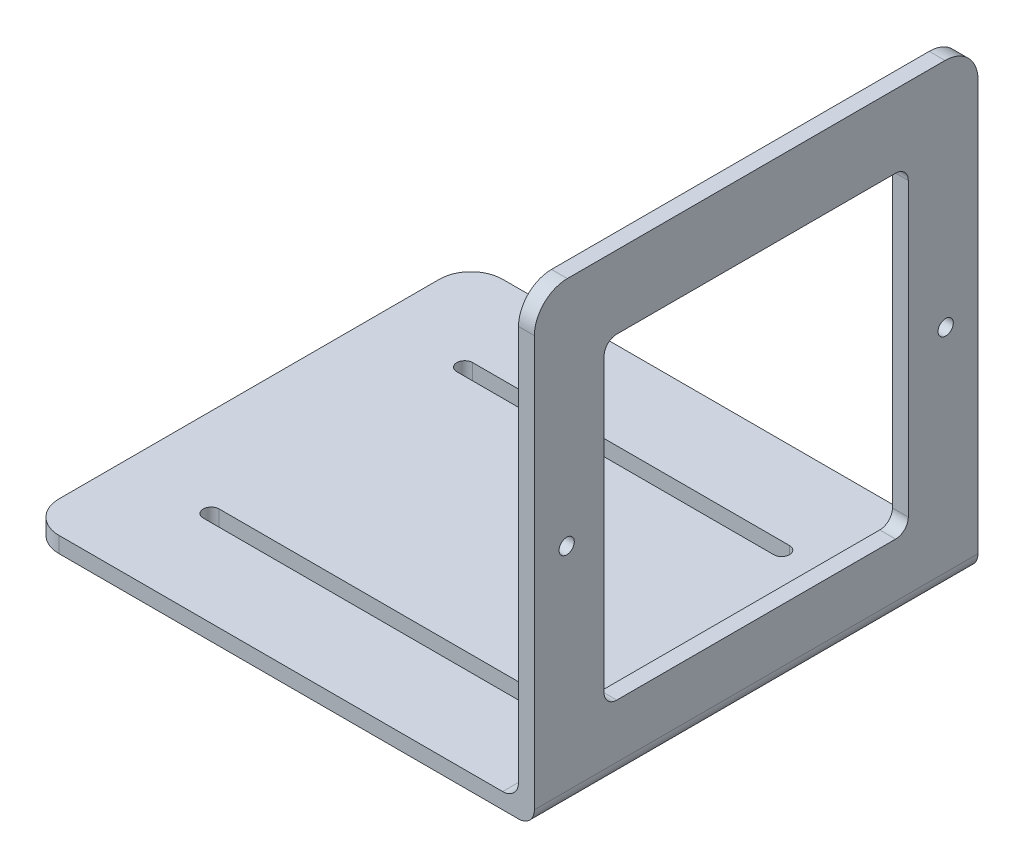
ISO-10303-21;
HEADER;
FILE_DESCRIPTION(('STEP AP214'),'2;1');
FILE_NAME('part.step','',(''),(''),'','','');
FILE_SCHEMA(('AUTOMOTIVE_DESIGN { 1 0 10303 214 1 1 1 1 }'));
ENDSEC;
DATA;
#1=APPLICATION_CONTEXT('core data for automotive mechanical design processes');
#2=APPLICATION_PROTOCOL_DEFINITION('international standard','automotive_design',2000,#1);
#3=PRODUCT_CONTEXT('',#1,'mechanical');
#4=PRODUCT('Part','Part','',(#3));
#5=PRODUCT_RELATED_PRODUCT_CATEGORY('part','',(#4));
#6=PRODUCT_DEFINITION_FORMATION('','',#4);
#7=PRODUCT_DEFINITION_CONTEXT('part definition',#1,'design');
#8=PRODUCT_DEFINITION('design','',#6,#7);
#9=PRODUCT_DEFINITION_SHAPE('','',#8);
#10=(LENGTH_UNIT() NAMED_UNIT(*) SI_UNIT(.MILLI.,.METRE.));
#11=(NAMED_UNIT(*) PLANE_ANGLE_UNIT() SI_UNIT($,.RADIAN.));
#12=(NAMED_UNIT(*) SI_UNIT($,.STERADIAN.) SOLID_ANGLE_UNIT());
#13=UNCERTAINTY_MEASURE_WITH_UNIT(LENGTH_MEASURE(1.E-05),#10,'distance_accuracy_value','');
#14=(GEOMETRIC_REPRESENTATION_CONTEXT(3) GLOBAL_UNCERTAINTY_ASSIGNED_CONTEXT((#13)) GLOBAL_UNIT_ASSIGNED_CONTEXT((#10,
#11,#12)) REPRESENTATION_CONTEXT('',''));
#15=CARTESIAN_POINT('',(0.,0.,0.));
#16=DIRECTION('',(0.,0.,1.));
#17=DIRECTION('',(1.,0.,0.));
#18=AXIS2_PLACEMENT_3D('',#15,#16,#17);
#19=CARTESIAN_POINT('',(0.,3.175,0.));
#20=DIRECTION('',(-1.,0.,0.));
#21=DIRECTION('',(0.,0.,1.));
#22=AXIS2_PLACEMENT_3D('',#19,#20,#21);
#23=PLANE('',#22);
#24=DIRECTION('',(0.,0.,-1.));
#25=VECTOR('',#24,1.);
#26=CARTESIAN_POINT('',(0.,3.175,0.));
#27=LINE('',#26,#25);
#28=CARTESIAN_POINT('',(0.,3.175,38.1));
#29=VERTEX_POINT('',#28);
#30=CARTESIAN_POINT('',(0.,3.175,-38.1));
#31=VERTEX_POINT('',#30);
#32=EDGE_CURVE('E323',#29,#31,#27,.T.);
#33=ORIENTED_EDGE('',*,*,#32,.T.);
#34=DIRECTION('',(0.,-1.,0.));
#35=VECTOR('',#34,1.);
#36=CARTESIAN_POINT('',(0.,3.175,-38.1));
#37=LINE('',#36,#35);
#38=CARTESIAN_POINT('',(0.,0.,-38.1));
#39=VERTEX_POINT('',#38);
#40=EDGE_CURVE('E436',#31,#39,#37,.T.);
#41=ORIENTED_EDGE('',*,*,#40,.T.);
#42=DIRECTION('',(0.,0.,-1.));
#43=VECTOR('',#42,1.);
#44=CARTESIAN_POINT('',(0.,0.,0.));
#45=LINE('',#44,#43);
#46=CARTESIAN_POINT('',(0.,0.,38.1));
#47=VERTEX_POINT('',#46);
#48=EDGE_CURVE('E322',#47,#39,#45,.T.);
#49=ORIENTED_EDGE('',*,*,#48,.F.);
#50=DIRECTION('',(0.,-1.,0.));
#51=VECTOR('',#50,1.);
#52=CARTESIAN_POINT('',(0.,3.175,38.1));
#53=LINE('',#52,#51);
#54=EDGE_CURVE('E434',#47,#29,#53,.F.);
#55=ORIENTED_EDGE('',*,*,#54,.T.);
#56=EDGE_LOOP('',(#33,#41,#49,#55));
#57=FACE_BOUND('',#56,.T.);
#58=ADVANCED_FACE('F36',(#57),#23,.T.);
#59=CARTESIAN_POINT('',(0.,3.175,44.45));
#60=DIRECTION('',(0.,0.,-1.));
#61=DIRECTION('',(-1.,0.,0.));
#62=AXIS2_PLACEMENT_3D('',#59,#60,#61);
#63=PLANE('',#62);
#64=DIRECTION('',(1.,0.,0.));
#65=VECTOR('',#64,1.);
#66=CARTESIAN_POINT('',(0.,3.175,44.45));
#67=LINE('',#66,#65);
#68=CARTESIAN_POINT('',(6.35,3.175,44.45));
#69=VERTEX_POINT('',#68);
#70=CARTESIAN_POINT('',(95.25,3.175,44.45));
#71=VERTEX_POINT('',#70);
#72=EDGE_CURVE('E326',#69,#71,#67,.T.);
#73=ORIENTED_EDGE('',*,*,#72,.F.);
#74=DIRECTION('',(0.,-1.,0.));
#75=VECTOR('',#74,1.);
#76=CARTESIAN_POINT('',(6.35,0.,44.45));
#77=LINE('',#76,#75);
#78=CARTESIAN_POINT('',(6.35,0.,44.45));
#79=VERTEX_POINT('',#78);
#80=EDGE_CURVE('E11',#69,#79,#77,.T.);
#81=ORIENTED_EDGE('',*,*,#80,.T.);
#82=DIRECTION('',(1.,0.,0.));
#83=VECTOR('',#82,1.);
#84=CARTESIAN_POINT('',(0.,0.,44.45));
#85=LINE('',#84,#83);
#86=CARTESIAN_POINT('',(98.425,0.,44.45));
#87=VERTEX_POINT('',#86);
#88=EDGE_CURVE('E334',#79,#87,#85,.T.);
#89=ORIENTED_EDGE('',*,*,#88,.T.);
#90=CARTESIAN_POINT('',(98.425,3.175,44.45));
#91=DIRECTION('',(0.,0.,-1.));
#92=DIRECTION('',(-1.,0.,0.));
#93=AXIS2_PLACEMENT_3D('',#90,#91,#92);
#94=CIRCLE('',#93,3.175);
#95=CARTESIAN_POINT('',(101.6,3.175,44.45));
#96=VERTEX_POINT('',#95);
#97=EDGE_CURVE('E427',#87,#96,#94,.F.);
#98=ORIENTED_EDGE('',*,*,#97,.T.);
#99=DIRECTION('',(0.,-1.,0.));
#100=VECTOR('',#99,1.);
#101=CARTESIAN_POINT('',(101.6,3.175,44.45));
#102=LINE('',#101,#100);
#103=CARTESIAN_POINT('',(101.6,85.471,44.45));
#104=VERTEX_POINT('',#103);
#105=EDGE_CURVE('E339',#104,#96,#102,.T.);
#106=ORIENTED_EDGE('',*,*,#105,.F.);
#107=DIRECTION('',(1.,0.,0.));
#108=VECTOR('',#107,1.);
#109=CARTESIAN_POINT('',(0.,85.471,44.45));
#110=LINE('',#109,#108);
#111=CARTESIAN_POINT('',(98.425,85.471,44.45));
#112=VERTEX_POINT('',#111);
#113=EDGE_CURVE('E404',#104,#112,#110,.F.);
#114=ORIENTED_EDGE('',*,*,#113,.T.);
#115=DIRECTION('',(0.,-1.,0.));
#116=VECTOR('',#115,1.);
#117=CARTESIAN_POINT('',(98.425,92.075,44.45));
#118=LINE('',#117,#116);
#119=CARTESIAN_POINT('',(98.425,6.34999999999999,44.45));
#120=VERTEX_POINT('',#119);
#121=EDGE_CURVE('E316',#112,#120,#118,.T.);
#122=ORIENTED_EDGE('',*,*,#121,.T.);
#123=CARTESIAN_POINT('',(95.25,6.34999999999999,44.45));
#124=DIRECTION('',(0.,0.,-1.));
#125=DIRECTION('',(-1.,0.,0.));
#126=AXIS2_PLACEMENT_3D('',#123,#124,#125);
#127=CIRCLE('',#126,3.175);
#128=EDGE_CURVE('E429',#120,#71,#127,.T.);
#129=ORIENTED_EDGE('',*,*,#128,.T.);
#130=EDGE_LOOP('',(#73,#81,#89,#98,#106,#114,#122,#129));
#131=FACE_BOUND('',#130,.T.);
#132=ADVANCED_FACE('F472',(#131),#63,.F.);
#133=CARTESIAN_POINT('',(101.6,3.175,0.));
#134=DIRECTION('',(-1.,0.,0.));
#135=DIRECTION('',(0.,0.,1.));
#136=AXIS2_PLACEMENT_3D('',#133,#134,#135);
#137=PLANE('',#136);
#138=CARTESIAN_POINT('',(101.6,45.72,37.973));
#139=DIRECTION('',(1.,0.,0.));
#140=DIRECTION('',(0.,0.,-1.));
#141=AXIS2_PLACEMENT_3D('',#138,#139,#140);
#142=CIRCLE('',#141,1.524);
#143=CARTESIAN_POINT('',(101.6,45.72,36.449));
#144=VERTEX_POINT('',#143);
#145=EDGE_CURVE('E291',#144,#144,#142,.T.);
#146=ORIENTED_EDGE('',*,*,#145,.F.);
#147=EDGE_LOOP('',(#146));
#148=FACE_BOUND('',#147,.T.);
#149=CARTESIAN_POINT('',(101.6,45.72,-37.973));
#150=DIRECTION('',(1.,0.,0.));
#151=DIRECTION('',(0.,0.,-1.));
#152=AXIS2_PLACEMENT_3D('',#149,#150,#151);
#153=CIRCLE('',#152,1.524);
#154=CARTESIAN_POINT('',(101.6,45.72,-39.497));
#155=VERTEX_POINT('',#154);
#156=EDGE_CURVE('E295',#155,#155,#153,.T.);
#157=ORIENTED_EDGE('',*,*,#156,.F.);
#158=EDGE_LOOP('',(#157));
#159=FACE_BOUND('',#158,.T.);
#160=DIRECTION('',(0.,0.,-1.));
#161=VECTOR('',#160,1.);
#162=CARTESIAN_POINT('',(101.6,13.97,-30.48));
#163=LINE('',#162,#161);
#164=CARTESIAN_POINT('',(101.6,13.97,27.94));
#165=VERTEX_POINT('',#164);
#166=CARTESIAN_POINT('',(101.6,13.97,-27.94));
#167=VERTEX_POINT('',#166);
#168=EDGE_CURVE('E301',#165,#167,#163,.T.);
#169=ORIENTED_EDGE('',*,*,#168,.F.);
#170=CARTESIAN_POINT('',(101.6,16.51,27.94));
#171=DIRECTION('',(-1.,0.,0.));
#172=DIRECTION('',(0.,0.,1.));
#173=AXIS2_PLACEMENT_3D('',#170,#171,#172);
#174=CIRCLE('',#173,2.54);
#175=CARTESIAN_POINT('',(101.6,16.51,30.48));
#176=VERTEX_POINT('',#175);
#177=EDGE_CURVE('E386',#165,#176,#174,.T.);
#178=ORIENTED_EDGE('',*,*,#177,.T.);
#179=DIRECTION('',(0.,-1.,0.));
#180=VECTOR('',#179,1.);
#181=CARTESIAN_POINT('',(101.6,13.97,30.48));
#182=LINE('',#181,#180);
#183=CARTESIAN_POINT('',(101.6,74.93,30.48));
#184=VERTEX_POINT('',#183);
#185=EDGE_CURVE('E258',#184,#176,#182,.T.);
#186=ORIENTED_EDGE('',*,*,#185,.F.);
#187=CARTESIAN_POINT('',(101.6,74.93,27.94));
#188=DIRECTION('',(-1.,0.,0.));
#189=DIRECTION('',(0.,0.,1.));
#190=AXIS2_PLACEMENT_3D('',#187,#188,#189);
#191=CIRCLE('',#190,2.54);
#192=CARTESIAN_POINT('',(101.6,77.47,27.94));
#193=VERTEX_POINT('',#192);
#194=EDGE_CURVE('E390',#184,#193,#191,.T.);
#195=ORIENTED_EDGE('',*,*,#194,.T.);
#196=DIRECTION('',(0.,0.,1.));
#197=VECTOR('',#196,1.);
#198=CARTESIAN_POINT('',(101.6,77.47,-30.48));
#199=LINE('',#198,#197);
#200=CARTESIAN_POINT('',(101.6,77.47,-27.94));
#201=VERTEX_POINT('',#200);
#202=EDGE_CURVE('E298',#201,#193,#199,.T.);
#203=ORIENTED_EDGE('',*,*,#202,.F.);
#204=CARTESIAN_POINT('',(101.6,74.93,-27.94));
#205=DIRECTION('',(-1.,0.,0.));
#206=DIRECTION('',(0.,0.,1.));
#207=AXIS2_PLACEMENT_3D('',#204,#205,#206);
#208=CIRCLE('',#207,2.54);
#209=CARTESIAN_POINT('',(101.6,74.93,-30.48));
#210=VERTEX_POINT('',#209);
#211=EDGE_CURVE('E382',#201,#210,#208,.T.);
#212=ORIENTED_EDGE('',*,*,#211,.T.);
#213=DIRECTION('',(0.,1.,0.));
#214=VECTOR('',#213,1.);
#215=CARTESIAN_POINT('',(101.6,13.97,-30.48));
#216=LINE('',#215,#214);
#217=CARTESIAN_POINT('',(101.6,16.51,-30.48));
#218=VERTEX_POINT('',#217);
#219=EDGE_CURVE('E304',#218,#210,#216,.T.);
#220=ORIENTED_EDGE('',*,*,#219,.F.);
#221=CARTESIAN_POINT('',(101.6,16.51,-27.94));
#222=DIRECTION('',(-1.,0.,0.));
#223=DIRECTION('',(0.,0.,1.));
#224=AXIS2_PLACEMENT_3D('',#221,#222,#223);
#225=CIRCLE('',#224,2.54);
#226=EDGE_CURVE('E378',#218,#167,#225,.T.);
#227=ORIENTED_EDGE('',*,*,#226,.T.);
#228=EDGE_LOOP('',(#169,#178,#186,#195,#203,#212,#220,#227));
#229=FACE_BOUND('',#228,.T.);
#230=ORIENTED_EDGE('',*,*,#105,.T.);
#231=DIRECTION('',(0.,0.,-1.));
#232=VECTOR('',#231,1.);
#233=CARTESIAN_POINT('',(101.6,3.175,0.));
#234=LINE('',#233,#232);
#235=CARTESIAN_POINT('',(101.6,3.175,-44.45));
#236=VERTEX_POINT('',#235);
#237=EDGE_CURVE('E418',#96,#236,#234,.T.);
#238=ORIENTED_EDGE('',*,*,#237,.T.);
#239=DIRECTION('',(0.,-1.,0.));
#240=VECTOR('',#239,1.);
#241=CARTESIAN_POINT('',(101.6,3.175,-44.45));
#242=LINE('',#241,#240);
#243=CARTESIAN_POINT('',(101.6,85.471,-44.45));
#244=VERTEX_POINT('',#243);
#245=EDGE_CURVE('E331',#244,#236,#242,.T.);
#246=ORIENTED_EDGE('',*,*,#245,.F.);
#247=CARTESIAN_POINT('',(101.6,85.471,-37.846));
#248=DIRECTION('',(-1.,0.,0.));
#249=DIRECTION('',(0.,0.,1.));
#250=AXIS2_PLACEMENT_3D('',#247,#248,#249);
#251=CIRCLE('',#250,6.604);
#252=CARTESIAN_POINT('',(101.6,92.075,-37.846));
#253=VERTEX_POINT('',#252);
#254=EDGE_CURVE('E400',#244,#253,#251,.F.);
#255=ORIENTED_EDGE('',*,*,#254,.T.);
#256=DIRECTION('',(0.,0.,-1.));
#257=VECTOR('',#256,1.);
#258=CARTESIAN_POINT('',(101.6,92.075,-44.45));
#259=LINE('',#258,#257);
#260=CARTESIAN_POINT('',(101.6,92.075,37.846));
#261=VERTEX_POINT('',#260);
#262=EDGE_CURVE('E309',#261,#253,#259,.T.);
#263=ORIENTED_EDGE('',*,*,#262,.F.);
#264=CARTESIAN_POINT('',(101.6,85.471,37.846));
#265=DIRECTION('',(-1.,0.,0.));
#266=DIRECTION('',(0.,0.,1.));
#267=AXIS2_PLACEMENT_3D('',#264,#265,#266);
#268=CIRCLE('',#267,6.604);
#269=EDGE_CURVE('E402',#261,#104,#268,.F.);
#270=ORIENTED_EDGE('',*,*,#269,.T.);
#271=EDGE_LOOP('',(#230,#238,#246,#255,#263,#270));
#272=FACE_BOUND('',#271,.T.);
#273=ADVANCED_FACE('F496',(#148,#159,#229,#272),#137,.F.);
#274=CARTESIAN_POINT('',(0.,3.175,-44.45));
#275=DIRECTION('',(0.,0.,-1.));
#276=DIRECTION('',(-1.,0.,0.));
#277=AXIS2_PLACEMENT_3D('',#274,#275,#276);
#278=PLANE('',#277);
#279=DIRECTION('',(1.,0.,0.));
#280=VECTOR('',#279,1.);
#281=CARTESIAN_POINT('',(0.,0.,-44.45));
#282=LINE('',#281,#280);
#283=CARTESIAN_POINT('',(6.35,0.,-44.45));
#284=VERTEX_POINT('',#283);
#285=CARTESIAN_POINT('',(98.425,0.,-44.45));
#286=VERTEX_POINT('',#285);
#287=EDGE_CURVE('E327',#284,#286,#282,.T.);
#288=ORIENTED_EDGE('',*,*,#287,.F.);
#289=DIRECTION('',(0.,-1.,0.));
#290=VECTOR('',#289,1.);
#291=CARTESIAN_POINT('',(6.35,3.175,-44.45));
#292=LINE('',#291,#290);
#293=CARTESIAN_POINT('',(6.35,3.175,-44.45));
#294=VERTEX_POINT('',#293);
#295=EDGE_CURVE('E443',#284,#294,#292,.F.);
#296=ORIENTED_EDGE('',*,*,#295,.T.);
#297=DIRECTION('',(1.,0.,0.));
#298=VECTOR('',#297,1.);
#299=CARTESIAN_POINT('',(0.,3.175,-44.45));
#300=LINE('',#299,#298);
#301=CARTESIAN_POINT('',(95.25,3.175,-44.45));
#302=VERTEX_POINT('',#301);
#303=EDGE_CURVE('E329',#294,#302,#300,.T.);
#304=ORIENTED_EDGE('',*,*,#303,.T.);
#305=CARTESIAN_POINT('',(95.25,6.34999999999999,-44.45));
#306=DIRECTION('',(0.,0.,-1.));
#307=DIRECTION('',(-1.,0.,0.));
#308=AXIS2_PLACEMENT_3D('',#305,#306,#307);
#309=CIRCLE('',#308,3.175);
#310=CARTESIAN_POINT('',(98.425,6.34999999999999,-44.45));
#311=VERTEX_POINT('',#310);
#312=EDGE_CURVE('E432',#302,#311,#309,.F.);
#313=ORIENTED_EDGE('',*,*,#312,.T.);
#314=DIRECTION('',(0.,-1.,0.));
#315=VECTOR('',#314,1.);
#316=CARTESIAN_POINT('',(98.425,92.075,-44.45));
#317=LINE('',#316,#315);
#318=CARTESIAN_POINT('',(98.425,85.471,-44.45));
#319=VERTEX_POINT('',#318);
#320=EDGE_CURVE('E319',#319,#311,#317,.T.);
#321=ORIENTED_EDGE('',*,*,#320,.F.);
#322=DIRECTION('',(-1.,0.,0.));
#323=VECTOR('',#322,1.);
#324=CARTESIAN_POINT('',(101.6,85.471,-44.45));
#325=LINE('',#324,#323);
#326=EDGE_CURVE('E410',#319,#244,#325,.F.);
#327=ORIENTED_EDGE('',*,*,#326,.T.);
#328=ORIENTED_EDGE('',*,*,#245,.T.);
#329=CARTESIAN_POINT('',(98.425,3.175,-44.45));
#330=DIRECTION('',(0.,0.,-1.));
#331=DIRECTION('',(-1.,0.,0.));
#332=AXIS2_PLACEMENT_3D('',#329,#330,#331);
#333=CIRCLE('',#332,3.175);
#334=EDGE_CURVE('E421',#236,#286,#333,.T.);
#335=ORIENTED_EDGE('',*,*,#334,.T.);
#336=EDGE_LOOP('',(#288,#296,#304,#313,#321,#327,#328,#335));
#337=FACE_BOUND('',#336,.T.);
#338=ADVANCED_FACE('F462',(#337),#278,.T.);
#339=CARTESIAN_POINT('',(0.,3.175,0.));
#340=DIRECTION('',(0.,1.,0.));
#341=DIRECTION('',(0.,0.,1.));
#342=AXIS2_PLACEMENT_3D('',#339,#340,#341);
#343=PLANE('',#342);
#344=CARTESIAN_POINT('',(17.7957258123316,3.175,-25.4));
#345=DIRECTION('',(0.,1.,0.));
#346=DIRECTION('',(0.,0.,1.));
#347=AXIS2_PLACEMENT_3D('',#344,#345,#346);
#348=CIRCLE('',#347,1.5875);
#349=CARTESIAN_POINT('',(17.7957258123316,3.175,-26.9875));
#350=VERTEX_POINT('',#349);
#351=CARTESIAN_POINT('',(17.7957258123316,3.175,-23.8125));
#352=VERTEX_POINT('',#351);
#353=EDGE_CURVE('E51',#350,#352,#348,.T.);
#354=ORIENTED_EDGE('',*,*,#353,.F.);
#355=DIRECTION('',(-1.,0.,0.));
#356=VECTOR('',#355,1.);
#357=CARTESIAN_POINT('',(17.7957258123316,3.175,-26.9875));
#358=LINE('',#357,#356);
#359=CARTESIAN_POINT('',(81.2957258123316,3.175,-26.9875));
#360=VERTEX_POINT('',#359);
#361=EDGE_CURVE('E242',#360,#350,#358,.T.);
#362=ORIENTED_EDGE('',*,*,#361,.F.);
#363=CARTESIAN_POINT('',(81.2957258123316,3.175,-25.4));
#364=DIRECTION('',(0.,1.,0.));
#365=DIRECTION('',(0.,0.,1.));
#366=AXIS2_PLACEMENT_3D('',#363,#364,#365);
#367=CIRCLE('',#366,1.5875);
#368=CARTESIAN_POINT('',(81.2957258123316,3.175,-23.8125));
#369=VERTEX_POINT('',#368);
#370=EDGE_CURVE('E245',#369,#360,#367,.T.);
#371=ORIENTED_EDGE('',*,*,#370,.F.);
#372=DIRECTION('',(1.,0.,0.));
#373=VECTOR('',#372,1.);
#374=CARTESIAN_POINT('',(17.7957258123316,3.175,-23.8125));
#375=LINE('',#374,#373);
#376=EDGE_CURVE('E251',#352,#369,#375,.T.);
#377=ORIENTED_EDGE('',*,*,#376,.F.);
#378=EDGE_LOOP('',(#354,#362,#371,#377));
#379=FACE_BOUND('',#378,.T.);
#380=CARTESIAN_POINT('',(17.7957258123316,3.175,25.4));
#381=DIRECTION('',(0.,1.,0.));
#382=DIRECTION('',(0.,0.,-1.));
#383=AXIS2_PLACEMENT_3D('',#380,#381,#382);
#384=CIRCLE('',#383,1.5875);
#385=CARTESIAN_POINT('',(17.7957258123316,3.175,23.8125));
#386=VERTEX_POINT('',#385);
#387=CARTESIAN_POINT('',(17.7957258123316,3.175,26.9875));
#388=VERTEX_POINT('',#387);
#389=EDGE_CURVE('E59',#386,#388,#384,.T.);
#390=ORIENTED_EDGE('',*,*,#389,.F.);
#391=DIRECTION('',(-1.,0.,0.));
#392=VECTOR('',#391,1.);
#393=CARTESIAN_POINT('',(17.7957258123316,3.175,23.8125));
#394=LINE('',#393,#392);
#395=CARTESIAN_POINT('',(81.2957258123316,3.175,23.8125));
#396=VERTEX_POINT('',#395);
#397=EDGE_CURVE('E266',#396,#386,#394,.T.);
#398=ORIENTED_EDGE('',*,*,#397,.F.);
#399=CARTESIAN_POINT('',(81.2957258123316,3.175,25.4));
#400=DIRECTION('',(0.,1.,0.));
#401=DIRECTION('',(0.,0.,-1.));
#402=AXIS2_PLACEMENT_3D('',#399,#400,#401);
#403=CIRCLE('',#402,1.5875);
#404=CARTESIAN_POINT('',(81.2957258123316,3.175,26.9875));
#405=VERTEX_POINT('',#404);
#406=EDGE_CURVE('E280',#405,#396,#403,.T.);
#407=ORIENTED_EDGE('',*,*,#406,.F.);
#408=DIRECTION('',(1.,0.,0.));
#409=VECTOR('',#408,1.);
#410=CARTESIAN_POINT('',(17.7957258123316,3.175,26.9875));
#411=LINE('',#410,#409);
#412=EDGE_CURVE('E277',#388,#405,#411,.T.);
#413=ORIENTED_EDGE('',*,*,#412,.F.);
#414=EDGE_LOOP('',(#390,#398,#407,#413));
#415=FACE_BOUND('',#414,.T.);
#416=ORIENTED_EDGE('',*,*,#303,.F.);
#417=CARTESIAN_POINT('',(6.35,3.175,-38.1));
#418=DIRECTION('',(0.,1.,0.));
#419=DIRECTION('',(0.,0.,1.));
#420=AXIS2_PLACEMENT_3D('',#417,#418,#419);
#421=CIRCLE('',#420,6.35);
#422=EDGE_CURVE('E44',#294,#31,#421,.T.);
#423=ORIENTED_EDGE('',*,*,#422,.T.);
#424=ORIENTED_EDGE('',*,*,#32,.F.);
#425=CARTESIAN_POINT('',(6.35,3.175,38.1));
#426=DIRECTION('',(0.,1.,0.));
#427=DIRECTION('',(0.,0.,1.));
#428=AXIS2_PLACEMENT_3D('',#425,#426,#427);
#429=CIRCLE('',#428,6.35);
#430=EDGE_CURVE('E445',#29,#69,#429,.T.);
#431=ORIENTED_EDGE('',*,*,#430,.T.);
#432=ORIENTED_EDGE('',*,*,#72,.T.);
#433=DIRECTION('',(0.,0.,1.));
#434=VECTOR('',#433,1.);
#435=CARTESIAN_POINT('',(95.25,3.175,0.));
#436=LINE('',#435,#434);
#437=EDGE_CURVE('E415',#71,#302,#436,.F.);
#438=ORIENTED_EDGE('',*,*,#437,.T.);
#439=EDGE_LOOP('',(#416,#423,#424,#431,#432,#438));
#440=FACE_BOUND('',#439,.T.);
#441=ADVANCED_FACE('F450',(#379,#415,#440),#343,.T.);
#442=CARTESIAN_POINT('',(0.,0.,0.));
#443=DIRECTION('',(0.,1.,0.));
#444=DIRECTION('',(0.,0.,1.));
#445=AXIS2_PLACEMENT_3D('',#442,#443,#444);
#446=PLANE('',#445);
#447=DIRECTION('',(-1.,0.,0.));
#448=VECTOR('',#447,1.);
#449=CARTESIAN_POINT('',(17.7957258123316,0.,-26.9875));
#450=LINE('',#449,#448);
#451=CARTESIAN_POINT('',(81.2957258123316,0.,-26.9875));
#452=VERTEX_POINT('',#451);
#453=CARTESIAN_POINT('',(17.7957258123316,0.,-26.9875));
#454=VERTEX_POINT('',#453);
#455=EDGE_CURVE('E229',#452,#454,#450,.T.);
#456=ORIENTED_EDGE('',*,*,#455,.T.);
#457=CARTESIAN_POINT('',(17.7957258123316,0.,-25.4));
#458=DIRECTION('',(0.,1.,0.));
#459=DIRECTION('',(0.,0.,1.));
#460=AXIS2_PLACEMENT_3D('',#457,#458,#459);
#461=CIRCLE('',#460,1.5875);
#462=CARTESIAN_POINT('',(17.7957258123316,0.,-23.8125));
#463=VERTEX_POINT('',#462);
#464=EDGE_CURVE('E223',#454,#463,#461,.T.);
#465=ORIENTED_EDGE('',*,*,#464,.T.);
#466=DIRECTION('',(1.,0.,0.));
#467=VECTOR('',#466,1.);
#468=CARTESIAN_POINT('',(17.7957258123316,0.,-23.8125));
#469=LINE('',#468,#467);
#470=CARTESIAN_POINT('',(81.2957258123316,0.,-23.8125));
#471=VERTEX_POINT('',#470);
#472=EDGE_CURVE('E233',#463,#471,#469,.T.);
#473=ORIENTED_EDGE('',*,*,#472,.T.);
#474=CARTESIAN_POINT('',(81.2957258123316,0.,-25.4));
#475=DIRECTION('',(0.,1.,0.));
#476=DIRECTION('',(0.,0.,1.));
#477=AXIS2_PLACEMENT_3D('',#474,#475,#476);
#478=CIRCLE('',#477,1.5875);
#479=EDGE_CURVE('E237',#471,#452,#478,.T.);
#480=ORIENTED_EDGE('',*,*,#479,.T.);
#481=EDGE_LOOP('',(#456,#465,#473,#480));
#482=FACE_BOUND('',#481,.T.);
#483=DIRECTION('',(-1.,0.,0.));
#484=VECTOR('',#483,1.);
#485=CARTESIAN_POINT('',(17.7957258123316,0.,23.8125));
#486=LINE('',#485,#484);
#487=CARTESIAN_POINT('',(81.2957258123316,0.,23.8125));
#488=VERTEX_POINT('',#487);
#489=CARTESIAN_POINT('',(17.7957258123316,0.,23.8125));
#490=VERTEX_POINT('',#489);
#491=EDGE_CURVE('E272',#488,#490,#486,.T.);
#492=ORIENTED_EDGE('',*,*,#491,.T.);
#493=CARTESIAN_POINT('',(17.7957258123316,0.,25.4));
#494=DIRECTION('',(0.,1.,0.));
#495=DIRECTION('',(0.,0.,-1.));
#496=AXIS2_PLACEMENT_3D('',#493,#494,#495);
#497=CIRCLE('',#496,1.5875);
#498=CARTESIAN_POINT('',(17.7957258123316,0.,26.9875));
#499=VERTEX_POINT('',#498);
#500=EDGE_CURVE('E262',#490,#499,#497,.T.);
#501=ORIENTED_EDGE('',*,*,#500,.T.);
#502=DIRECTION('',(1.,0.,0.));
#503=VECTOR('',#502,1.);
#504=CARTESIAN_POINT('',(17.7957258123316,0.,26.9875));
#505=LINE('',#504,#503);
#506=CARTESIAN_POINT('',(81.2957258123316,0.,26.9875));
#507=VERTEX_POINT('',#506);
#508=EDGE_CURVE('E265',#499,#507,#505,.T.);
#509=ORIENTED_EDGE('',*,*,#508,.T.);
#510=CARTESIAN_POINT('',(81.2957258123316,0.,25.4));
#511=DIRECTION('',(0.,1.,0.));
#512=DIRECTION('',(0.,0.,-1.));
#513=AXIS2_PLACEMENT_3D('',#510,#511,#512);
#514=CIRCLE('',#513,1.5875);
#515=EDGE_CURVE('E269',#507,#488,#514,.T.);
#516=ORIENTED_EDGE('',*,*,#515,.T.);
#517=EDGE_LOOP('',(#492,#501,#509,#516));
#518=FACE_BOUND('',#517,.T.);
#519=ORIENTED_EDGE('',*,*,#48,.T.);
#520=CARTESIAN_POINT('',(6.35,0.,-38.1));
#521=DIRECTION('',(0.,1.,0.));
#522=DIRECTION('',(0.,0.,1.));
#523=AXIS2_PLACEMENT_3D('',#520,#521,#522);
#524=CIRCLE('',#523,6.35);
#525=EDGE_CURVE('E441',#39,#284,#524,.F.);
#526=ORIENTED_EDGE('',*,*,#525,.T.);
#527=ORIENTED_EDGE('',*,*,#287,.T.);
#528=DIRECTION('',(0.,0.,-1.));
#529=VECTOR('',#528,1.);
#530=CARTESIAN_POINT('',(98.425,0.,0.));
#531=LINE('',#530,#529);
#532=EDGE_CURVE('E424',#286,#87,#531,.F.);
#533=ORIENTED_EDGE('',*,*,#532,.T.);
#534=ORIENTED_EDGE('',*,*,#88,.F.);
#535=CARTESIAN_POINT('',(6.35,0.,38.1));
#536=DIRECTION('',(0.,1.,0.));
#537=DIRECTION('',(0.,0.,1.));
#538=AXIS2_PLACEMENT_3D('',#535,#536,#537);
#539=CIRCLE('',#538,6.35);
#540=EDGE_CURVE('E439',#79,#47,#539,.F.);
#541=ORIENTED_EDGE('',*,*,#540,.T.);
#542=EDGE_LOOP('',(#519,#526,#527,#533,#534,#541));
#543=FACE_BOUND('',#542,.T.);
#544=ADVANCED_FACE('F239',(#482,#518,#543),#446,.F.);
#545=CARTESIAN_POINT('',(98.425,92.075,-44.45));
#546=DIRECTION('',(1.,0.,0.));
#547=DIRECTION('',(0.,0.,-1.));
#548=AXIS2_PLACEMENT_3D('',#545,#546,#547);
#549=PLANE('',#548);
#550=CARTESIAN_POINT('',(98.425,45.72,37.973));
#551=DIRECTION('',(1.,0.,0.));
#552=DIRECTION('',(0.,0.,-1.));
#553=AXIS2_PLACEMENT_3D('',#550,#551,#552);
#554=CIRCLE('',#553,1.524);
#555=CARTESIAN_POINT('',(98.425,45.72,36.449));
#556=VERTEX_POINT('',#555);
#557=EDGE_CURVE('E313',#556,#556,#554,.T.);
#558=ORIENTED_EDGE('',*,*,#557,.T.);
#559=EDGE_LOOP('',(#558));
#560=FACE_BOUND('',#559,.T.);
#561=CARTESIAN_POINT('',(98.425,45.72,-37.973));
#562=DIRECTION('',(1.,0.,0.));
#563=DIRECTION('',(0.,0.,-1.));
#564=AXIS2_PLACEMENT_3D('',#561,#562,#563);
#565=CIRCLE('',#564,1.524);
#566=CARTESIAN_POINT('',(98.425,45.72,-39.497));
#567=VERTEX_POINT('',#566);
#568=EDGE_CURVE('E294',#567,#567,#565,.T.);
#569=ORIENTED_EDGE('',*,*,#568,.T.);
#570=EDGE_LOOP('',(#569));
#571=FACE_BOUND('',#570,.T.);
#572=DIRECTION('',(0.,1.,0.));
#573=VECTOR('',#572,1.);
#574=CARTESIAN_POINT('',(98.425,92.075,-30.48));
#575=LINE('',#574,#573);
#576=CARTESIAN_POINT('',(98.425,16.51,-30.48));
#577=VERTEX_POINT('',#576);
#578=CARTESIAN_POINT('',(98.425,74.93,-30.48));
#579=VERTEX_POINT('',#578);
#580=EDGE_CURVE('E345',#577,#579,#575,.T.);
#581=ORIENTED_EDGE('',*,*,#580,.T.);
#582=CARTESIAN_POINT('',(98.425,74.93,-27.94));
#583=DIRECTION('',(1.,0.,0.));
#584=DIRECTION('',(0.,0.,-1.));
#585=AXIS2_PLACEMENT_3D('',#582,#583,#584);
#586=CIRCLE('',#585,2.54);
#587=CARTESIAN_POINT('',(98.425,77.47,-27.94));
#588=VERTEX_POINT('',#587);
#589=EDGE_CURVE('E384',#579,#588,#586,.T.);
#590=ORIENTED_EDGE('',*,*,#589,.T.);
#591=DIRECTION('',(0.,0.,1.));
#592=VECTOR('',#591,1.);
#593=CARTESIAN_POINT('',(98.425,77.47,-44.45));
#594=LINE('',#593,#592);
#595=CARTESIAN_POINT('',(98.425,77.47,27.94));
#596=VERTEX_POINT('',#595);
#597=EDGE_CURVE('E348',#588,#596,#594,.T.);
#598=ORIENTED_EDGE('',*,*,#597,.T.);
#599=CARTESIAN_POINT('',(98.425,74.93,27.94));
#600=DIRECTION('',(1.,0.,0.));
#601=DIRECTION('',(0.,0.,-1.));
#602=AXIS2_PLACEMENT_3D('',#599,#600,#601);
#603=CIRCLE('',#602,2.54);
#604=CARTESIAN_POINT('',(98.425,74.93,30.48));
#605=VERTEX_POINT('',#604);
#606=EDGE_CURVE('E392',#596,#605,#603,.T.);
#607=ORIENTED_EDGE('',*,*,#606,.T.);
#608=DIRECTION('',(0.,-1.,0.));
#609=VECTOR('',#608,1.);
#610=CARTESIAN_POINT('',(98.425,92.075,30.48));
#611=LINE('',#610,#609);
#612=CARTESIAN_POINT('',(98.425,16.51,30.48));
#613=VERTEX_POINT('',#612);
#614=EDGE_CURVE('E351',#605,#613,#611,.T.);
#615=ORIENTED_EDGE('',*,*,#614,.T.);
#616=CARTESIAN_POINT('',(98.425,16.51,27.94));
#617=DIRECTION('',(1.,0.,0.));
#618=DIRECTION('',(0.,0.,-1.));
#619=AXIS2_PLACEMENT_3D('',#616,#617,#618);
#620=CIRCLE('',#619,2.54);
#621=CARTESIAN_POINT('',(98.425,13.97,27.94));
#622=VERTEX_POINT('',#621);
#623=EDGE_CURVE('E388',#613,#622,#620,.T.);
#624=ORIENTED_EDGE('',*,*,#623,.T.);
#625=DIRECTION('',(0.,0.,-1.));
#626=VECTOR('',#625,1.);
#627=CARTESIAN_POINT('',(98.425,13.97,-44.45));
#628=LINE('',#627,#626);
#629=CARTESIAN_POINT('',(98.425,13.97,-27.94));
#630=VERTEX_POINT('',#629);
#631=EDGE_CURVE('E342',#622,#630,#628,.T.);
#632=ORIENTED_EDGE('',*,*,#631,.T.);
#633=CARTESIAN_POINT('',(98.425,16.51,-27.94));
#634=DIRECTION('',(1.,0.,0.));
#635=DIRECTION('',(0.,0.,-1.));
#636=AXIS2_PLACEMENT_3D('',#633,#634,#635);
#637=CIRCLE('',#636,2.54);
#638=EDGE_CURVE('E380',#630,#577,#637,.T.);
#639=ORIENTED_EDGE('',*,*,#638,.T.);
#640=EDGE_LOOP('',(#581,#590,#598,#607,#615,#624,#632,#639));
#641=FACE_BOUND('',#640,.T.);
#642=ORIENTED_EDGE('',*,*,#320,.T.);
#643=DIRECTION('',(0.,0.,1.));
#644=VECTOR('',#643,1.);
#645=CARTESIAN_POINT('',(98.425,6.34999999999999,-44.45));
#646=LINE('',#645,#644);
#647=EDGE_CURVE('E412',#311,#120,#646,.T.);
#648=ORIENTED_EDGE('',*,*,#647,.T.);
#649=ORIENTED_EDGE('',*,*,#121,.F.);
#650=CARTESIAN_POINT('',(98.425,85.471,37.846));
#651=DIRECTION('',(1.,0.,0.));
#652=DIRECTION('',(0.,0.,-1.));
#653=AXIS2_PLACEMENT_3D('',#650,#651,#652);
#654=CIRCLE('',#653,6.604);
#655=CARTESIAN_POINT('',(98.425,92.075,37.846));
#656=VERTEX_POINT('',#655);
#657=EDGE_CURVE('E408',#112,#656,#654,.F.);
#658=ORIENTED_EDGE('',*,*,#657,.T.);
#659=DIRECTION('',(0.,0.,1.));
#660=VECTOR('',#659,1.);
#661=CARTESIAN_POINT('',(98.425,92.075,-44.45));
#662=LINE('',#661,#660);
#663=CARTESIAN_POINT('',(98.425,92.075,-37.846));
#664=VERTEX_POINT('',#663);
#665=EDGE_CURVE('E312',#664,#656,#662,.T.);
#666=ORIENTED_EDGE('',*,*,#665,.F.);
#667=CARTESIAN_POINT('',(98.425,85.471,-37.846));
#668=DIRECTION('',(1.,0.,0.));
#669=DIRECTION('',(0.,0.,-1.));
#670=AXIS2_PLACEMENT_3D('',#667,#668,#669);
#671=CIRCLE('',#670,6.604);
#672=EDGE_CURVE('E406',#664,#319,#671,.F.);
#673=ORIENTED_EDGE('',*,*,#672,.T.);
#674=EDGE_LOOP('',(#642,#648,#649,#658,#666,#673));
#675=FACE_BOUND('',#674,.T.);
#676=ADVANCED_FACE('F485',(#560,#571,#641,#675),#549,.F.);
#677=CARTESIAN_POINT('',(0.,92.075,0.));
#678=DIRECTION('',(0.,-1.,0.));
#679=DIRECTION('',(0.,0.,-1.));
#680=AXIS2_PLACEMENT_3D('',#677,#678,#679);
#681=PLANE('',#680);
#682=ORIENTED_EDGE('',*,*,#665,.T.);
#683=DIRECTION('',(1.,0.,0.));
#684=VECTOR('',#683,1.);
#685=CARTESIAN_POINT('',(0.,92.075,37.846));
#686=LINE('',#685,#684);
#687=EDGE_CURVE('E397',#656,#261,#686,.T.);
#688=ORIENTED_EDGE('',*,*,#687,.T.);
#689=ORIENTED_EDGE('',*,*,#262,.T.);
#690=DIRECTION('',(-1.,0.,0.));
#691=VECTOR('',#690,1.);
#692=CARTESIAN_POINT('',(98.425,92.075,-37.846));
#693=LINE('',#692,#691);
#694=EDGE_CURVE('E394',#253,#664,#693,.T.);
#695=ORIENTED_EDGE('',*,*,#694,.T.);
#696=EDGE_LOOP('',(#682,#688,#689,#695));
#697=FACE_BOUND('',#696,.T.);
#698=ADVANCED_FACE('F492',(#697),#681,.F.);
#699=CARTESIAN_POINT('',(0.,13.97,30.48));
#700=DIRECTION('',(0.,0.,1.));
#701=DIRECTION('',(1.,0.,0.));
#702=AXIS2_PLACEMENT_3D('',#699,#700,#701);
#703=PLANE('',#702);
#704=ORIENTED_EDGE('',*,*,#185,.T.);
#705=DIRECTION('',(1.,0.,0.));
#706=VECTOR('',#705,1.);
#707=CARTESIAN_POINT('',(98.425,16.51,30.48));
#708=LINE('',#707,#706);
#709=EDGE_CURVE('E376',#176,#613,#708,.F.);
#710=ORIENTED_EDGE('',*,*,#709,.T.);
#711=ORIENTED_EDGE('',*,*,#614,.F.);
#712=DIRECTION('',(1.,0.,0.));
#713=VECTOR('',#712,1.);
#714=CARTESIAN_POINT('',(101.6,74.93,30.48));
#715=LINE('',#714,#713);
#716=EDGE_CURVE('E373',#605,#184,#715,.T.);
#717=ORIENTED_EDGE('',*,*,#716,.T.);
#718=EDGE_LOOP('',(#704,#710,#711,#717));
#719=FACE_BOUND('',#718,.T.);
#720=ADVANCED_FACE('F561',(#719),#703,.F.);
#721=CARTESIAN_POINT('',(0.,77.47,-30.48));
#722=DIRECTION('',(0.,1.,0.));
#723=DIRECTION('',(0.,0.,1.));
#724=AXIS2_PLACEMENT_3D('',#721,#722,#723);
#725=PLANE('',#724);
#726=ORIENTED_EDGE('',*,*,#597,.F.);
#727=DIRECTION('',(1.,0.,0.));
#728=VECTOR('',#727,1.);
#729=CARTESIAN_POINT('',(101.6,77.47,-27.94));
#730=LINE('',#729,#728);
#731=EDGE_CURVE('E370',#588,#201,#730,.T.);
#732=ORIENTED_EDGE('',*,*,#731,.T.);
#733=ORIENTED_EDGE('',*,*,#202,.T.);
#734=DIRECTION('',(1.,0.,0.));
#735=VECTOR('',#734,1.);
#736=CARTESIAN_POINT('',(98.425,77.47,27.94));
#737=LINE('',#736,#735);
#738=EDGE_CURVE('E368',#193,#596,#737,.F.);
#739=ORIENTED_EDGE('',*,*,#738,.T.);
#740=EDGE_LOOP('',(#726,#732,#733,#739));
#741=FACE_BOUND('',#740,.T.);
#742=ADVANCED_FACE('F556',(#741),#725,.F.);
#743=CARTESIAN_POINT('',(0.,13.97,-30.48));
#744=DIRECTION('',(0.,0.,-1.));
#745=DIRECTION('',(-1.,0.,0.));
#746=AXIS2_PLACEMENT_3D('',#743,#744,#745);
#747=PLANE('',#746);
#748=ORIENTED_EDGE('',*,*,#580,.F.);
#749=DIRECTION('',(1.,0.,0.));
#750=VECTOR('',#749,1.);
#751=CARTESIAN_POINT('',(101.6,16.51,-30.48));
#752=LINE('',#751,#750);
#753=EDGE_CURVE('E360',#577,#218,#752,.T.);
#754=ORIENTED_EDGE('',*,*,#753,.T.);
#755=ORIENTED_EDGE('',*,*,#219,.T.);
#756=DIRECTION('',(1.,0.,0.));
#757=VECTOR('',#756,1.);
#758=CARTESIAN_POINT('',(98.425,74.93,-30.48));
#759=LINE('',#758,#757);
#760=EDGE_CURVE('E354',#210,#579,#759,.F.);
#761=ORIENTED_EDGE('',*,*,#760,.T.);
#762=EDGE_LOOP('',(#748,#754,#755,#761));
#763=FACE_BOUND('',#762,.T.);
#764=ADVANCED_FACE('F549',(#763),#747,.F.);
#765=CARTESIAN_POINT('',(0.,13.97,-30.48));
#766=DIRECTION('',(0.,-1.,0.));
#767=DIRECTION('',(0.,0.,-1.));
#768=AXIS2_PLACEMENT_3D('',#765,#766,#767);
#769=PLANE('',#768);
#770=ORIENTED_EDGE('',*,*,#168,.T.);
#771=DIRECTION('',(1.,0.,0.));
#772=VECTOR('',#771,1.);
#773=CARTESIAN_POINT('',(98.425,13.97,-27.94));
#774=LINE('',#773,#772);
#775=EDGE_CURVE('E366',#167,#630,#774,.F.);
#776=ORIENTED_EDGE('',*,*,#775,.T.);
#777=ORIENTED_EDGE('',*,*,#631,.F.);
#778=DIRECTION('',(1.,0.,0.));
#779=VECTOR('',#778,1.);
#780=CARTESIAN_POINT('',(101.6,13.97,27.94));
#781=LINE('',#780,#779);
#782=EDGE_CURVE('E363',#622,#165,#781,.T.);
#783=ORIENTED_EDGE('',*,*,#782,.T.);
#784=EDGE_LOOP('',(#770,#776,#777,#783));
#785=FACE_BOUND('',#784,.T.);
#786=ADVANCED_FACE('F542',(#785),#769,.F.);
#787=CARTESIAN_POINT('',(0.,45.72,-37.973));
#788=DIRECTION('',(1.,0.,0.));
#789=DIRECTION('',(0.,0.,-1.));
#790=AXIS2_PLACEMENT_3D('',#787,#788,#789);
#791=CYLINDRICAL_SURFACE('',#790,1.524);
#792=ORIENTED_EDGE('',*,*,#156,.T.);
#793=EDGE_LOOP('',(#792));
#794=FACE_BOUND('',#793,.T.);
#795=ORIENTED_EDGE('',*,*,#568,.F.);
#796=EDGE_LOOP('',(#795));
#797=FACE_BOUND('',#796,.T.);
#798=ADVANCED_FACE('F589',(#794,#797),#791,.F.);
#799=CARTESIAN_POINT('',(0.,45.72,37.973));
#800=DIRECTION('',(1.,0.,0.));
#801=DIRECTION('',(0.,0.,-1.));
#802=AXIS2_PLACEMENT_3D('',#799,#800,#801);
#803=CYLINDRICAL_SURFACE('',#802,1.524);
#804=ORIENTED_EDGE('',*,*,#145,.T.);
#805=EDGE_LOOP('',(#804));
#806=FACE_BOUND('',#805,.T.);
#807=ORIENTED_EDGE('',*,*,#557,.F.);
#808=EDGE_LOOP('',(#807));
#809=FACE_BOUND('',#808,.T.);
#810=ADVANCED_FACE('F525',(#806,#809),#803,.F.);
#811=CARTESIAN_POINT('',(0.,16.51,-27.94));
#812=DIRECTION('',(-1.,0.,0.));
#813=DIRECTION('',(0.,0.,1.));
#814=AXIS2_PLACEMENT_3D('',#811,#812,#813);
#815=CYLINDRICAL_SURFACE('',#814,2.54);
#816=ORIENTED_EDGE('',*,*,#638,.F.);
#817=ORIENTED_EDGE('',*,*,#775,.F.);
#818=ORIENTED_EDGE('',*,*,#226,.F.);
#819=ORIENTED_EDGE('',*,*,#753,.F.);
#820=EDGE_LOOP('',(#816,#817,#818,#819));
#821=FACE_BOUND('',#820,.T.);
#822=ADVANCED_FACE('F521',(#821),#815,.F.);
#823=CARTESIAN_POINT('',(0.,74.93,-27.94));
#824=DIRECTION('',(-1.,0.,0.));
#825=DIRECTION('',(0.,0.,1.));
#826=AXIS2_PLACEMENT_3D('',#823,#824,#825);
#827=CYLINDRICAL_SURFACE('',#826,2.54);
#828=ORIENTED_EDGE('',*,*,#589,.F.);
#829=ORIENTED_EDGE('',*,*,#760,.F.);
#830=ORIENTED_EDGE('',*,*,#211,.F.);
#831=ORIENTED_EDGE('',*,*,#731,.F.);
#832=EDGE_LOOP('',(#828,#829,#830,#831));
#833=FACE_BOUND('',#832,.T.);
#834=ADVANCED_FACE('F524',(#833),#827,.F.);
#835=CARTESIAN_POINT('',(0.,16.51,27.94));
#836=DIRECTION('',(-1.,0.,0.));
#837=DIRECTION('',(0.,0.,1.));
#838=AXIS2_PLACEMENT_3D('',#835,#836,#837);
#839=CYLINDRICAL_SURFACE('',#838,2.54);
#840=ORIENTED_EDGE('',*,*,#623,.F.);
#841=ORIENTED_EDGE('',*,*,#709,.F.);
#842=ORIENTED_EDGE('',*,*,#177,.F.);
#843=ORIENTED_EDGE('',*,*,#782,.F.);
#844=EDGE_LOOP('',(#840,#841,#842,#843));
#845=FACE_BOUND('',#844,.T.);
#846=ADVANCED_FACE('F509',(#845),#839,.F.);
#847=CARTESIAN_POINT('',(0.,74.93,27.94));
#848=DIRECTION('',(-1.,0.,0.));
#849=DIRECTION('',(0.,0.,1.));
#850=AXIS2_PLACEMENT_3D('',#847,#848,#849);
#851=CYLINDRICAL_SURFACE('',#850,2.54);
#852=ORIENTED_EDGE('',*,*,#606,.F.);
#853=ORIENTED_EDGE('',*,*,#738,.F.);
#854=ORIENTED_EDGE('',*,*,#194,.F.);
#855=ORIENTED_EDGE('',*,*,#716,.F.);
#856=EDGE_LOOP('',(#852,#853,#854,#855));
#857=FACE_BOUND('',#856,.T.);
#858=ADVANCED_FACE('F502',(#857),#851,.F.);
#859=CARTESIAN_POINT('',(0.,85.471,37.846));
#860=DIRECTION('',(1.,0.,0.));
#861=DIRECTION('',(0.,0.,-1.));
#862=AXIS2_PLACEMENT_3D('',#859,#860,#861);
#863=CYLINDRICAL_SURFACE('',#862,6.604);
#864=ORIENTED_EDGE('',*,*,#657,.F.);
#865=ORIENTED_EDGE('',*,*,#113,.F.);
#866=ORIENTED_EDGE('',*,*,#269,.F.);
#867=ORIENTED_EDGE('',*,*,#687,.F.);
#868=EDGE_LOOP('',(#864,#865,#866,#867));
#869=FACE_BOUND('',#868,.T.);
#870=ADVANCED_FACE('F500',(#869),#863,.T.);
#871=CARTESIAN_POINT('',(0.,85.471,-37.846));
#872=DIRECTION('',(1.,0.,0.));
#873=DIRECTION('',(0.,0.,-1.));
#874=AXIS2_PLACEMENT_3D('',#871,#872,#873);
#875=CYLINDRICAL_SURFACE('',#874,6.604);
#876=ORIENTED_EDGE('',*,*,#254,.F.);
#877=ORIENTED_EDGE('',*,*,#326,.F.);
#878=ORIENTED_EDGE('',*,*,#672,.F.);
#879=ORIENTED_EDGE('',*,*,#694,.F.);
#880=EDGE_LOOP('',(#876,#877,#878,#879));
#881=FACE_BOUND('',#880,.T.);
#882=ADVANCED_FACE('F490',(#881),#875,.T.);
#883=CARTESIAN_POINT('',(95.25,6.34999999999999,-44.45));
#884=DIRECTION('',(0.,0.,1.));
#885=DIRECTION('',(1.,0.,0.));
#886=AXIS2_PLACEMENT_3D('',#883,#884,#885);
#887=CYLINDRICAL_SURFACE('',#886,3.175);
#888=ORIENTED_EDGE('',*,*,#312,.F.);
#889=ORIENTED_EDGE('',*,*,#437,.F.);
#890=ORIENTED_EDGE('',*,*,#128,.F.);
#891=ORIENTED_EDGE('',*,*,#647,.F.);
#892=EDGE_LOOP('',(#888,#889,#890,#891));
#893=FACE_BOUND('',#892,.T.);
#894=ADVANCED_FACE('F481',(#893),#887,.F.);
#895=CARTESIAN_POINT('',(98.425,3.175,0.));
#896=DIRECTION('',(0.,0.,-1.));
#897=DIRECTION('',(-1.,0.,0.));
#898=AXIS2_PLACEMENT_3D('',#895,#896,#897);
#899=CYLINDRICAL_SURFACE('',#898,3.175);
#900=ORIENTED_EDGE('',*,*,#97,.F.);
#901=ORIENTED_EDGE('',*,*,#532,.F.);
#902=ORIENTED_EDGE('',*,*,#334,.F.);
#903=ORIENTED_EDGE('',*,*,#237,.F.);
#904=EDGE_LOOP('',(#900,#901,#902,#903));
#905=FACE_BOUND('',#904,.T.);
#906=ADVANCED_FACE('F468',(#905),#899,.T.);
#907=CARTESIAN_POINT('',(6.35,3.175,-38.1));
#908=DIRECTION('',(0.,-1.,0.));
#909=DIRECTION('',(0.,0.,-1.));
#910=AXIS2_PLACEMENT_3D('',#907,#908,#909);
#911=CYLINDRICAL_SURFACE('',#910,6.35);
#912=ORIENTED_EDGE('',*,*,#422,.F.);
#913=ORIENTED_EDGE('',*,*,#295,.F.);
#914=ORIENTED_EDGE('',*,*,#525,.F.);
#915=ORIENTED_EDGE('',*,*,#40,.F.);
#916=EDGE_LOOP('',(#912,#913,#914,#915));
#917=FACE_BOUND('',#916,.T.);
#918=ADVANCED_FACE('F458',(#917),#911,.T.);
#919=CARTESIAN_POINT('',(6.35,3.175,38.1));
#920=DIRECTION('',(0.,1.,0.));
#921=DIRECTION('',(0.,0.,1.));
#922=AXIS2_PLACEMENT_3D('',#919,#920,#921);
#923=CYLINDRICAL_SURFACE('',#922,6.35);
#924=ORIENTED_EDGE('',*,*,#430,.F.);
#925=ORIENTED_EDGE('',*,*,#54,.F.);
#926=ORIENTED_EDGE('',*,*,#540,.F.);
#927=ORIENTED_EDGE('',*,*,#80,.F.);
#928=EDGE_LOOP('',(#924,#925,#926,#927));
#929=FACE_BOUND('',#928,.T.);
#930=ADVANCED_FACE('F38',(#929),#923,.T.);
#931=CARTESIAN_POINT('',(17.7957258123316,0.,25.4));
#932=DIRECTION('',(0.,1.,0.));
#933=DIRECTION('',(0.,0.,1.));
#934=AXIS2_PLACEMENT_3D('',#931,#932,#933);
#935=CYLINDRICAL_SURFACE('',#934,1.5875);
#936=ORIENTED_EDGE('',*,*,#389,.T.);
#937=DIRECTION('',(0.,1.,0.));
#938=VECTOR('',#937,1.);
#939=CARTESIAN_POINT('',(17.7957258123316,0.,26.9875));
#940=LINE('',#939,#938);
#941=EDGE_CURVE('E275',#499,#388,#940,.T.);
#942=ORIENTED_EDGE('',*,*,#941,.F.);
#943=ORIENTED_EDGE('',*,*,#500,.F.);
#944=DIRECTION('',(0.,1.,0.));
#945=VECTOR('',#944,1.);
#946=CARTESIAN_POINT('',(17.7957258123316,0.,23.8125));
#947=LINE('',#946,#945);
#948=EDGE_CURVE('E252',#490,#386,#947,.T.);
#949=ORIENTED_EDGE('',*,*,#948,.T.);
#950=EDGE_LOOP('',(#936,#942,#943,#949));
#951=FACE_BOUND('',#950,.T.);
#952=ADVANCED_FACE('F600',(#951),#935,.F.);
#953=CARTESIAN_POINT('',(17.7957258123316,0.,23.8125));
#954=DIRECTION('',(0.,0.,-1.));
#955=DIRECTION('',(-1.,0.,0.));
#956=AXIS2_PLACEMENT_3D('',#953,#954,#955);
#957=PLANE('',#956);
#958=ORIENTED_EDGE('',*,*,#397,.T.);
#959=ORIENTED_EDGE('',*,*,#948,.F.);
#960=ORIENTED_EDGE('',*,*,#491,.F.);
#961=DIRECTION('',(0.,1.,0.));
#962=VECTOR('',#961,1.);
#963=CARTESIAN_POINT('',(81.2957258123316,0.,23.8125));
#964=LINE('',#963,#962);
#965=EDGE_CURVE('E286',#488,#396,#964,.T.);
#966=ORIENTED_EDGE('',*,*,#965,.T.);
#967=EDGE_LOOP('',(#958,#959,#960,#966));
#968=FACE_BOUND('',#967,.T.);
#969=ADVANCED_FACE('F603',(#968),#957,.F.);
#970=CARTESIAN_POINT('',(81.2957258123316,0.,25.4));
#971=DIRECTION('',(0.,1.,0.));
#972=DIRECTION('',(0.,0.,1.));
#973=AXIS2_PLACEMENT_3D('',#970,#971,#972);
#974=CYLINDRICAL_SURFACE('',#973,1.5875);
#975=ORIENTED_EDGE('',*,*,#406,.T.);
#976=ORIENTED_EDGE('',*,*,#965,.F.);
#977=ORIENTED_EDGE('',*,*,#515,.F.);
#978=DIRECTION('',(0.,1.,0.));
#979=VECTOR('',#978,1.);
#980=CARTESIAN_POINT('',(81.2957258123316,0.,26.9875));
#981=LINE('',#980,#979);
#982=EDGE_CURVE('E288',#507,#405,#981,.T.);
#983=ORIENTED_EDGE('',*,*,#982,.T.);
#984=EDGE_LOOP('',(#975,#976,#977,#983));
#985=FACE_BOUND('',#984,.T.);
#986=ADVANCED_FACE('F607',(#985),#974,.F.);
#987=CARTESIAN_POINT('',(17.7957258123316,0.,26.9875));
#988=DIRECTION('',(0.,0.,1.));
#989=DIRECTION('',(1.,0.,0.));
#990=AXIS2_PLACEMENT_3D('',#987,#988,#989);
#991=PLANE('',#990);
#992=ORIENTED_EDGE('',*,*,#412,.T.);
#993=ORIENTED_EDGE('',*,*,#982,.F.);
#994=ORIENTED_EDGE('',*,*,#508,.F.);
#995=ORIENTED_EDGE('',*,*,#941,.T.);
#996=EDGE_LOOP('',(#992,#993,#994,#995));
#997=FACE_BOUND('',#996,.T.);
#998=ADVANCED_FACE('F604',(#997),#991,.F.);
#999=CARTESIAN_POINT('',(17.7957258123316,0.,-25.4));
#1000=DIRECTION('',(0.,1.,0.));
#1001=DIRECTION('',(0.,0.,1.));
#1002=AXIS2_PLACEMENT_3D('',#999,#1000,#1001);
#1003=CYLINDRICAL_SURFACE('',#1002,1.5875);
#1004=ORIENTED_EDGE('',*,*,#353,.T.);
#1005=DIRECTION('',(0.,1.,0.));
#1006=VECTOR('',#1005,1.);
#1007=CARTESIAN_POINT('',(17.7957258123316,0.,-23.8125));
#1008=LINE('',#1007,#1006);
#1009=EDGE_CURVE('E219',#463,#352,#1008,.T.);
#1010=ORIENTED_EDGE('',*,*,#1009,.F.);
#1011=ORIENTED_EDGE('',*,*,#464,.F.);
#1012=DIRECTION('',(0.,1.,0.));
#1013=VECTOR('',#1012,1.);
#1014=CARTESIAN_POINT('',(17.7957258123316,0.,-26.9875));
#1015=LINE('',#1014,#1013);
#1016=EDGE_CURVE('E256',#454,#350,#1015,.T.);
#1017=ORIENTED_EDGE('',*,*,#1016,.T.);
#1018=EDGE_LOOP('',(#1004,#1010,#1011,#1017));
#1019=FACE_BOUND('',#1018,.T.);
#1020=ADVANCED_FACE('F221',(#1019),#1003,.F.);
#1021=CARTESIAN_POINT('',(17.7957258123316,0.,-26.9875));
#1022=DIRECTION('',(0.,0.,-1.));
#1023=DIRECTION('',(-1.,0.,0.));
#1024=AXIS2_PLACEMENT_3D('',#1021,#1022,#1023);
#1025=PLANE('',#1024);
#1026=ORIENTED_EDGE('',*,*,#361,.T.);
#1027=ORIENTED_EDGE('',*,*,#1016,.F.);
#1028=ORIENTED_EDGE('',*,*,#455,.F.);
#1029=DIRECTION('',(0.,1.,0.));
#1030=VECTOR('',#1029,1.);
#1031=CARTESIAN_POINT('',(81.2957258123316,0.,-26.9875));
#1032=LINE('',#1031,#1030);
#1033=EDGE_CURVE('E259',#452,#360,#1032,.T.);
#1034=ORIENTED_EDGE('',*,*,#1033,.T.);
#1035=EDGE_LOOP('',(#1026,#1027,#1028,#1034));
#1036=FACE_BOUND('',#1035,.T.);
#1037=ADVANCED_FACE('F617',(#1036),#1025,.F.);
#1038=CARTESIAN_POINT('',(81.2957258123316,0.,-25.4));
#1039=DIRECTION('',(0.,1.,0.));
#1040=DIRECTION('',(0.,0.,1.));
#1041=AXIS2_PLACEMENT_3D('',#1038,#1039,#1040);
#1042=CYLINDRICAL_SURFACE('',#1041,1.5875);
#1043=ORIENTED_EDGE('',*,*,#370,.T.);
#1044=ORIENTED_EDGE('',*,*,#1033,.F.);
#1045=ORIENTED_EDGE('',*,*,#479,.F.);
#1046=DIRECTION('',(0.,1.,0.));
#1047=VECTOR('',#1046,1.);
#1048=CARTESIAN_POINT('',(81.2957258123316,0.,-23.8125));
#1049=LINE('',#1048,#1047);
#1050=EDGE_CURVE('E228',#471,#369,#1049,.T.);
#1051=ORIENTED_EDGE('',*,*,#1050,.T.);
#1052=EDGE_LOOP('',(#1043,#1044,#1045,#1051));
#1053=FACE_BOUND('',#1052,.T.);
#1054=ADVANCED_FACE('F620',(#1053),#1042,.F.);
#1055=CARTESIAN_POINT('',(17.7957258123316,0.,-23.8125));
#1056=DIRECTION('',(0.,0.,1.));
#1057=DIRECTION('',(1.,0.,0.));
#1058=AXIS2_PLACEMENT_3D('',#1055,#1056,#1057);
#1059=PLANE('',#1058);
#1060=ORIENTED_EDGE('',*,*,#376,.T.);
#1061=ORIENTED_EDGE('',*,*,#1050,.F.);
#1062=ORIENTED_EDGE('',*,*,#472,.F.);
#1063=ORIENTED_EDGE('',*,*,#1009,.T.);
#1064=EDGE_LOOP('',(#1060,#1061,#1062,#1063));
#1065=FACE_BOUND('',#1064,.T.);
#1066=ADVANCED_FACE('F234',(#1065),#1059,.F.);
#1067=CLOSED_SHELL('',(#58,#132,#273,#338,#441,#544,#676,#698,#720,#742,#764,#786,#798,#810,
#822,#834,#846,#858,#870,#882,#894,#906,#918,#930,#952,#969,#986,#998,#1020,#1037,#1054,#1066));
#1068=MANIFOLD_SOLID_BREP('B2',#1067);
#1069=ADVANCED_BREP_SHAPE_REPRESENTATION('',(#18,#1068),#14);
#1070=SHAPE_DEFINITION_REPRESENTATION(#9,#1069);
ENDSEC;
END-ISO-10303-21;
